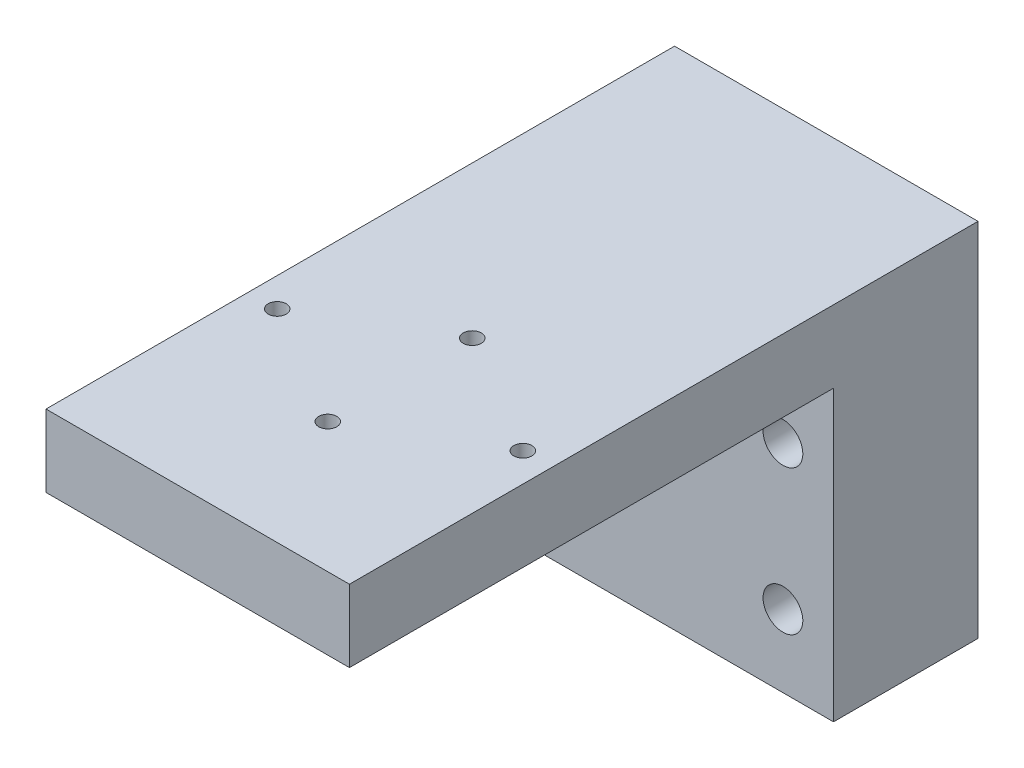
ISO-10303-21;
HEADER;
FILE_DESCRIPTION(('STEP AP214'),'2;1');
FILE_NAME('part.step','',(''),(''),'','','');
FILE_SCHEMA(('AUTOMOTIVE_DESIGN { 1 0 10303 214 1 1 1 1 }'));
ENDSEC;
DATA;
#1=APPLICATION_CONTEXT('core data for automotive mechanical design processes');
#2=APPLICATION_PROTOCOL_DEFINITION('international standard','automotive_design',2000,#1);
#3=PRODUCT_CONTEXT('',#1,'mechanical');
#4=PRODUCT('Part','Part','',(#3));
#5=PRODUCT_RELATED_PRODUCT_CATEGORY('part','',(#4));
#6=PRODUCT_DEFINITION_FORMATION('','',#4);
#7=PRODUCT_DEFINITION_CONTEXT('part definition',#1,'design');
#8=PRODUCT_DEFINITION('design','',#6,#7);
#9=PRODUCT_DEFINITION_SHAPE('','',#8);
#10=(LENGTH_UNIT() NAMED_UNIT(*) SI_UNIT(.MILLI.,.METRE.));
#11=(NAMED_UNIT(*) PLANE_ANGLE_UNIT() SI_UNIT($,.RADIAN.));
#12=(NAMED_UNIT(*) SI_UNIT($,.STERADIAN.) SOLID_ANGLE_UNIT());
#13=UNCERTAINTY_MEASURE_WITH_UNIT(LENGTH_MEASURE(1.E-05),#10,'distance_accuracy_value','');
#14=(GEOMETRIC_REPRESENTATION_CONTEXT(3) GLOBAL_UNCERTAINTY_ASSIGNED_CONTEXT((#13)) GLOBAL_UNIT_ASSIGNED_CONTEXT((#10,
#11,#12)) REPRESENTATION_CONTEXT('',''));
#15=CARTESIAN_POINT('',(0.,0.,0.));
#16=DIRECTION('',(0.,0.,1.));
#17=DIRECTION('',(1.,0.,0.));
#18=AXIS2_PLACEMENT_3D('',#15,#16,#17);
#19=CARTESIAN_POINT('',(0.,0.,87.));
#20=DIRECTION('',(1.,0.,0.));
#21=DIRECTION('',(0.,0.,-1.));
#22=AXIS2_PLACEMENT_3D('',#19,#20,#21);
#23=PLANE('',#22);
#24=DIRECTION('',(0.,1.,0.));
#25=VECTOR('',#24,1.);
#26=CARTESIAN_POINT('',(0.,0.,20.));
#27=LINE('',#26,#25);
#28=CARTESIAN_POINT('',(0.,0.,20.));
#29=VERTEX_POINT('',#28);
#30=CARTESIAN_POINT('',(0.,40.,20.));
#31=VERTEX_POINT('',#30);
#32=EDGE_CURVE('E125',#29,#31,#27,.T.);
#33=ORIENTED_EDGE('',*,*,#32,.T.);
#34=DIRECTION('',(0.,0.,1.));
#35=VECTOR('',#34,1.);
#36=CARTESIAN_POINT('',(0.,40.,87.));
#37=LINE('',#36,#35);
#38=CARTESIAN_POINT('',(0.,40.,87.));
#39=VERTEX_POINT('',#38);
#40=EDGE_CURVE('E206',#31,#39,#37,.T.);
#41=ORIENTED_EDGE('',*,*,#40,.T.);
#42=DIRECTION('',(0.,-1.,0.));
#43=VECTOR('',#42,1.);
#44=CARTESIAN_POINT('',(0.,0.,87.));
#45=LINE('',#44,#43);
#46=CARTESIAN_POINT('',(0.,50.,87.));
#47=VERTEX_POINT('',#46);
#48=EDGE_CURVE('E86',#47,#39,#45,.T.);
#49=ORIENTED_EDGE('',*,*,#48,.F.);
#50=DIRECTION('',(0.,0.,-1.));
#51=VECTOR('',#50,1.);
#52=CARTESIAN_POINT('',(0.,50.,87.));
#53=LINE('',#52,#51);
#54=CARTESIAN_POINT('',(0.,50.,0.));
#55=VERTEX_POINT('',#54);
#56=EDGE_CURVE('E79',#47,#55,#53,.T.);
#57=ORIENTED_EDGE('',*,*,#56,.T.);
#58=DIRECTION('',(0.,-1.,0.));
#59=VECTOR('',#58,1.);
#60=CARTESIAN_POINT('',(0.,0.,0.));
#61=LINE('',#60,#59);
#62=CARTESIAN_POINT('',(0.,0.,0.));
#63=VERTEX_POINT('',#62);
#64=EDGE_CURVE('E93',#55,#63,#61,.T.);
#65=ORIENTED_EDGE('',*,*,#64,.T.);
#66=DIRECTION('',(0.,0.,-1.));
#67=VECTOR('',#66,1.);
#68=CARTESIAN_POINT('',(0.,0.,87.));
#69=LINE('',#68,#67);
#70=EDGE_CURVE('E11',#29,#63,#69,.T.);
#71=ORIENTED_EDGE('',*,*,#70,.F.);
#72=EDGE_LOOP('',(#33,#41,#49,#57,#65,#71));
#73=FACE_BOUND('',#72,.T.);
#74=ADVANCED_FACE('F35',(#73),#23,.F.);
#75=CARTESIAN_POINT('',(0.,0.,87.));
#76=DIRECTION('',(0.,1.,0.));
#77=DIRECTION('',(0.,0.,1.));
#78=AXIS2_PLACEMENT_3D('',#75,#76,#77);
#79=PLANE('',#78);
#80=DIRECTION('',(0.,0.,-1.));
#81=VECTOR('',#80,1.);
#82=CARTESIAN_POINT('',(42.,0.,87.));
#83=LINE('',#82,#81);
#84=CARTESIAN_POINT('',(42.,0.,20.));
#85=VERTEX_POINT('',#84);
#86=CARTESIAN_POINT('',(42.,0.,0.));
#87=VERTEX_POINT('',#86);
#88=EDGE_CURVE('E42',#85,#87,#83,.T.);
#89=ORIENTED_EDGE('',*,*,#88,.F.);
#90=DIRECTION('',(1.,0.,0.));
#91=VECTOR('',#90,1.);
#92=CARTESIAN_POINT('',(0.,0.,20.));
#93=LINE('',#92,#91);
#94=EDGE_CURVE('E122',#29,#85,#93,.T.);
#95=ORIENTED_EDGE('',*,*,#94,.F.);
#96=ORIENTED_EDGE('',*,*,#70,.T.);
#97=DIRECTION('',(1.,0.,0.));
#98=VECTOR('',#97,1.);
#99=CARTESIAN_POINT('',(0.,0.,0.));
#100=LINE('',#99,#98);
#101=EDGE_CURVE('E99',#63,#87,#100,.T.);
#102=ORIENTED_EDGE('',*,*,#101,.T.);
#103=EDGE_LOOP('',(#89,#95,#96,#102));
#104=FACE_BOUND('',#103,.T.);
#105=ADVANCED_FACE('F119',(#104),#79,.F.);
#106=CARTESIAN_POINT('',(42.,0.,87.));
#107=DIRECTION('',(-1.,0.,0.));
#108=DIRECTION('',(0.,0.,1.));
#109=AXIS2_PLACEMENT_3D('',#106,#107,#108);
#110=PLANE('',#109);
#111=DIRECTION('',(0.,1.,0.));
#112=VECTOR('',#111,1.);
#113=CARTESIAN_POINT('',(42.,0.,87.));
#114=LINE('',#113,#112);
#115=CARTESIAN_POINT('',(42.,40.,87.));
#116=VERTEX_POINT('',#115);
#117=CARTESIAN_POINT('',(42.,50.,87.));
#118=VERTEX_POINT('',#117);
#119=EDGE_CURVE('E212',#116,#118,#114,.T.);
#120=ORIENTED_EDGE('',*,*,#119,.F.);
#121=DIRECTION('',(0.,0.,1.));
#122=VECTOR('',#121,1.);
#123=CARTESIAN_POINT('',(42.,40.,87.));
#124=LINE('',#123,#122);
#125=CARTESIAN_POINT('',(42.,40.,20.));
#126=VERTEX_POINT('',#125);
#127=EDGE_CURVE('E49',#126,#116,#124,.T.);
#128=ORIENTED_EDGE('',*,*,#127,.F.);
#129=DIRECTION('',(0.,1.,0.));
#130=VECTOR('',#129,1.);
#131=CARTESIAN_POINT('',(42.,0.,20.));
#132=LINE('',#131,#130);
#133=EDGE_CURVE('E116',#85,#126,#132,.T.);
#134=ORIENTED_EDGE('',*,*,#133,.F.);
#135=ORIENTED_EDGE('',*,*,#88,.T.);
#136=DIRECTION('',(0.,1.,0.));
#137=VECTOR('',#136,1.);
#138=CARTESIAN_POINT('',(42.,0.,0.));
#139=LINE('',#138,#137);
#140=CARTESIAN_POINT('',(42.,50.,0.));
#141=VERTEX_POINT('',#140);
#142=EDGE_CURVE('E87',#87,#141,#139,.T.);
#143=ORIENTED_EDGE('',*,*,#142,.T.);
#144=DIRECTION('',(0.,0.,-1.));
#145=VECTOR('',#144,1.);
#146=CARTESIAN_POINT('',(42.,50.,87.));
#147=LINE('',#146,#145);
#148=EDGE_CURVE('E82',#118,#141,#147,.T.);
#149=ORIENTED_EDGE('',*,*,#148,.F.);
#150=EDGE_LOOP('',(#120,#128,#134,#135,#143,#149));
#151=FACE_BOUND('',#150,.T.);
#152=ADVANCED_FACE('F113',(#151),#110,.F.);
#153=CARTESIAN_POINT('',(0.,50.,87.));
#154=DIRECTION('',(0.,-1.,0.));
#155=DIRECTION('',(0.,0.,-1.));
#156=AXIS2_PLACEMENT_3D('',#153,#154,#155);
#157=PLANE('',#156);
#158=CARTESIAN_POINT('',(3.99999999999992,50.,58.9999999999998));
#159=DIRECTION('',(0.,1.,0.));
#160=DIRECTION('',(0.,0.,1.));
#161=AXIS2_PLACEMENT_3D('',#158,#159,#160);
#162=CIRCLE('',#161,1.25);
#163=CARTESIAN_POINT('',(3.99999999999992,50.,60.2499999999998));
#164=VERTEX_POINT('',#163);
#165=EDGE_CURVE('E159',#164,#164,#162,.T.);
#166=ORIENTED_EDGE('',*,*,#165,.F.);
#167=EDGE_LOOP('',(#166));
#168=FACE_BOUND('',#167,.T.);
#169=CARTESIAN_POINT('',(20.9999999999999,50.,48.9999999999998));
#170=DIRECTION('',(0.,1.,0.));
#171=DIRECTION('',(0.,0.,1.));
#172=AXIS2_PLACEMENT_3D('',#169,#170,#171);
#173=CIRCLE('',#172,1.25);
#174=CARTESIAN_POINT('',(20.9999999999999,50.,50.2499999999998));
#175=VERTEX_POINT('',#174);
#176=EDGE_CURVE('E158',#175,#175,#173,.T.);
#177=ORIENTED_EDGE('',*,*,#176,.F.);
#178=EDGE_LOOP('',(#177));
#179=FACE_BOUND('',#178,.T.);
#180=CARTESIAN_POINT('',(37.9999999999999,50.,58.9999999999998));
#181=DIRECTION('',(0.,1.,0.));
#182=DIRECTION('',(0.,0.,1.));
#183=AXIS2_PLACEMENT_3D('',#180,#181,#182);
#184=CIRCLE('',#183,1.25);
#185=CARTESIAN_POINT('',(37.9999999999999,50.,60.2499999999998));
#186=VERTEX_POINT('',#185);
#187=EDGE_CURVE('E169',#186,#186,#184,.T.);
#188=ORIENTED_EDGE('',*,*,#187,.F.);
#189=EDGE_LOOP('',(#188));
#190=FACE_BOUND('',#189,.T.);
#191=CARTESIAN_POINT('',(20.9999999999999,50.,68.9999999999998));
#192=DIRECTION('',(0.,1.,0.));
#193=DIRECTION('',(0.,0.,1.));
#194=AXIS2_PLACEMENT_3D('',#191,#192,#193);
#195=CIRCLE('',#194,1.25);
#196=CARTESIAN_POINT('',(20.9999999999999,50.,70.2499999999998));
#197=VERTEX_POINT('',#196);
#198=EDGE_CURVE('E175',#197,#197,#195,.T.);
#199=ORIENTED_EDGE('',*,*,#198,.F.);
#200=EDGE_LOOP('',(#199));
#201=FACE_BOUND('',#200,.T.);
#202=DIRECTION('',(-1.,0.,0.));
#203=VECTOR('',#202,1.);
#204=CARTESIAN_POINT('',(0.,50.,0.));
#205=LINE('',#204,#203);
#206=EDGE_CURVE('E76',#141,#55,#205,.T.);
#207=ORIENTED_EDGE('',*,*,#206,.T.);
#208=ORIENTED_EDGE('',*,*,#56,.F.);
#209=DIRECTION('',(-1.,0.,0.));
#210=VECTOR('',#209,1.);
#211=CARTESIAN_POINT('',(0.,50.,87.));
#212=LINE('',#211,#210);
#213=EDGE_CURVE('E58',#118,#47,#212,.T.);
#214=ORIENTED_EDGE('',*,*,#213,.F.);
#215=ORIENTED_EDGE('',*,*,#148,.T.);
#216=EDGE_LOOP('',(#207,#208,#214,#215));
#217=FACE_BOUND('',#216,.T.);
#218=ADVANCED_FACE('F78',(#168,#179,#190,#201,#217),#157,.F.);
#219=CARTESIAN_POINT('',(0.,50.,87.));
#220=DIRECTION('',(0.,0.,-1.));
#221=DIRECTION('',(-1.,0.,0.));
#222=AXIS2_PLACEMENT_3D('',#219,#220,#221);
#223=PLANE('',#222);
#224=ORIENTED_EDGE('',*,*,#48,.T.);
#225=DIRECTION('',(1.,0.,0.));
#226=VECTOR('',#225,1.);
#227=CARTESIAN_POINT('',(0.,40.,87.));
#228=LINE('',#227,#226);
#229=EDGE_CURVE('E100',#39,#116,#228,.T.);
#230=ORIENTED_EDGE('',*,*,#229,.T.);
#231=ORIENTED_EDGE('',*,*,#119,.T.);
#232=ORIENTED_EDGE('',*,*,#213,.T.);
#233=EDGE_LOOP('',(#224,#230,#231,#232));
#234=FACE_BOUND('',#233,.T.);
#235=ADVANCED_FACE('F213',(#234),#223,.F.);
#236=CARTESIAN_POINT('',(0.,50.,0.));
#237=DIRECTION('',(0.,0.,-1.));
#238=DIRECTION('',(-1.,0.,0.));
#239=AXIS2_PLACEMENT_3D('',#236,#237,#238);
#240=PLANE('',#239);
#241=CARTESIAN_POINT('',(35.,30.,0.));
#242=DIRECTION('',(0.,0.,1.));
#243=DIRECTION('',(-1.,0.,0.));
#244=AXIS2_PLACEMENT_3D('',#241,#242,#243);
#245=CIRCLE('',#244,2.75);
#246=CARTESIAN_POINT('',(32.25,30.,0.));
#247=VERTEX_POINT('',#246);
#248=EDGE_CURVE('E182',#247,#247,#245,.T.);
#249=ORIENTED_EDGE('',*,*,#248,.T.);
#250=EDGE_LOOP('',(#249));
#251=FACE_BOUND('',#250,.T.);
#252=CARTESIAN_POINT('',(35.,10.,0.));
#253=DIRECTION('',(0.,0.,1.));
#254=DIRECTION('',(-1.,0.,0.));
#255=AXIS2_PLACEMENT_3D('',#252,#253,#254);
#256=CIRCLE('',#255,2.75);
#257=CARTESIAN_POINT('',(32.25,10.,0.));
#258=VERTEX_POINT('',#257);
#259=EDGE_CURVE('E188',#258,#258,#256,.T.);
#260=ORIENTED_EDGE('',*,*,#259,.T.);
#261=EDGE_LOOP('',(#260));
#262=FACE_BOUND('',#261,.T.);
#263=CARTESIAN_POINT('',(7.,10.,0.));
#264=DIRECTION('',(0.,0.,1.));
#265=DIRECTION('',(1.,0.,0.));
#266=AXIS2_PLACEMENT_3D('',#263,#264,#265);
#267=CIRCLE('',#266,2.75);
#268=CARTESIAN_POINT('',(9.75,10.,0.));
#269=VERTEX_POINT('',#268);
#270=EDGE_CURVE('E194',#269,#269,#267,.T.);
#271=ORIENTED_EDGE('',*,*,#270,.T.);
#272=EDGE_LOOP('',(#271));
#273=FACE_BOUND('',#272,.T.);
#274=CARTESIAN_POINT('',(7.,30.,0.));
#275=DIRECTION('',(0.,0.,1.));
#276=DIRECTION('',(1.,0.,0.));
#277=AXIS2_PLACEMENT_3D('',#274,#275,#276);
#278=CIRCLE('',#277,2.75);
#279=CARTESIAN_POINT('',(9.75,30.,0.));
#280=VERTEX_POINT('',#279);
#281=EDGE_CURVE('E200',#280,#280,#278,.T.);
#282=ORIENTED_EDGE('',*,*,#281,.T.);
#283=EDGE_LOOP('',(#282));
#284=FACE_BOUND('',#283,.T.);
#285=ORIENTED_EDGE('',*,*,#64,.F.);
#286=ORIENTED_EDGE('',*,*,#206,.F.);
#287=ORIENTED_EDGE('',*,*,#142,.F.);
#288=ORIENTED_EDGE('',*,*,#101,.F.);
#289=EDGE_LOOP('',(#285,#286,#287,#288));
#290=FACE_BOUND('',#289,.T.);
#291=ADVANCED_FACE('F97',(#251,#262,#273,#284,#290),#240,.T.);
#292=CARTESIAN_POINT('',(0.,40.,87.));
#293=DIRECTION('',(0.,1.,0.));
#294=DIRECTION('',(0.,0.,1.));
#295=AXIS2_PLACEMENT_3D('',#292,#293,#294);
#296=PLANE('',#295);
#297=ORIENTED_EDGE('',*,*,#127,.T.);
#298=ORIENTED_EDGE('',*,*,#229,.F.);
#299=ORIENTED_EDGE('',*,*,#40,.F.);
#300=DIRECTION('',(1.,0.,0.));
#301=VECTOR('',#300,1.);
#302=CARTESIAN_POINT('',(0.,40.,20.));
#303=LINE('',#302,#301);
#304=EDGE_CURVE('E103',#31,#126,#303,.T.);
#305=ORIENTED_EDGE('',*,*,#304,.T.);
#306=EDGE_LOOP('',(#297,#298,#299,#305));
#307=FACE_BOUND('',#306,.T.);
#308=ADVANCED_FACE('F215',(#307),#296,.F.);
#309=CARTESIAN_POINT('',(0.,0.,20.));
#310=DIRECTION('',(0.,0.,-1.));
#311=DIRECTION('',(-1.,0.,0.));
#312=AXIS2_PLACEMENT_3D('',#309,#310,#311);
#313=PLANE('',#312);
#314=CARTESIAN_POINT('',(35.,30.,20.));
#315=DIRECTION('',(0.,0.,1.));
#316=DIRECTION('',(-1.,0.,0.));
#317=AXIS2_PLACEMENT_3D('',#314,#315,#316);
#318=CIRCLE('',#317,2.75);
#319=CARTESIAN_POINT('',(32.25,30.,20.));
#320=VERTEX_POINT('',#319);
#321=EDGE_CURVE('E181',#320,#320,#318,.T.);
#322=ORIENTED_EDGE('',*,*,#321,.F.);
#323=EDGE_LOOP('',(#322));
#324=FACE_BOUND('',#323,.T.);
#325=CARTESIAN_POINT('',(35.,10.,20.));
#326=DIRECTION('',(0.,0.,1.));
#327=DIRECTION('',(-1.,0.,0.));
#328=AXIS2_PLACEMENT_3D('',#325,#326,#327);
#329=CIRCLE('',#328,2.75);
#330=CARTESIAN_POINT('',(32.25,10.,20.));
#331=VERTEX_POINT('',#330);
#332=EDGE_CURVE('E185',#331,#331,#329,.T.);
#333=ORIENTED_EDGE('',*,*,#332,.F.);
#334=EDGE_LOOP('',(#333));
#335=FACE_BOUND('',#334,.T.);
#336=CARTESIAN_POINT('',(7.,10.,20.));
#337=DIRECTION('',(0.,0.,1.));
#338=DIRECTION('',(1.,0.,0.));
#339=AXIS2_PLACEMENT_3D('',#336,#337,#338);
#340=CIRCLE('',#339,2.75);
#341=CARTESIAN_POINT('',(9.75,10.,20.));
#342=VERTEX_POINT('',#341);
#343=EDGE_CURVE('E191',#342,#342,#340,.T.);
#344=ORIENTED_EDGE('',*,*,#343,.F.);
#345=EDGE_LOOP('',(#344));
#346=FACE_BOUND('',#345,.T.);
#347=CARTESIAN_POINT('',(7.,30.,20.));
#348=DIRECTION('',(0.,0.,1.));
#349=DIRECTION('',(1.,0.,0.));
#350=AXIS2_PLACEMENT_3D('',#347,#348,#349);
#351=CIRCLE('',#350,2.75);
#352=CARTESIAN_POINT('',(9.75,30.,20.));
#353=VERTEX_POINT('',#352);
#354=EDGE_CURVE('E197',#353,#353,#351,.T.);
#355=ORIENTED_EDGE('',*,*,#354,.F.);
#356=EDGE_LOOP('',(#355));
#357=FACE_BOUND('',#356,.T.);
#358=ORIENTED_EDGE('',*,*,#133,.T.);
#359=ORIENTED_EDGE('',*,*,#304,.F.);
#360=ORIENTED_EDGE('',*,*,#32,.F.);
#361=ORIENTED_EDGE('',*,*,#94,.T.);
#362=EDGE_LOOP('',(#358,#359,#360,#361));
#363=FACE_BOUND('',#362,.T.);
#364=ADVANCED_FACE('F216',(#324,#335,#346,#357,#363),#313,.F.);
#365=CARTESIAN_POINT('',(7.,30.,0.));
#366=DIRECTION('',(0.,0.,1.));
#367=DIRECTION('',(1.,0.,0.));
#368=AXIS2_PLACEMENT_3D('',#365,#366,#367);
#369=CYLINDRICAL_SURFACE('',#368,2.75);
#370=ORIENTED_EDGE('',*,*,#281,.F.);
#371=EDGE_LOOP('',(#370));
#372=FACE_BOUND('',#371,.T.);
#373=ORIENTED_EDGE('',*,*,#354,.T.);
#374=EDGE_LOOP('',(#373));
#375=FACE_BOUND('',#374,.T.);
#376=ADVANCED_FACE('F218',(#372,#375),#369,.F.);
#377=CARTESIAN_POINT('',(7.,10.,0.));
#378=DIRECTION('',(0.,0.,1.));
#379=DIRECTION('',(1.,0.,0.));
#380=AXIS2_PLACEMENT_3D('',#377,#378,#379);
#381=CYLINDRICAL_SURFACE('',#380,2.75);
#382=ORIENTED_EDGE('',*,*,#270,.F.);
#383=EDGE_LOOP('',(#382));
#384=FACE_BOUND('',#383,.T.);
#385=ORIENTED_EDGE('',*,*,#343,.T.);
#386=EDGE_LOOP('',(#385));
#387=FACE_BOUND('',#386,.T.);
#388=ADVANCED_FACE('F226',(#384,#387),#381,.F.);
#389=CARTESIAN_POINT('',(35.,10.,0.));
#390=DIRECTION('',(0.,0.,1.));
#391=DIRECTION('',(1.,0.,0.));
#392=AXIS2_PLACEMENT_3D('',#389,#390,#391);
#393=CYLINDRICAL_SURFACE('',#392,2.75);
#394=ORIENTED_EDGE('',*,*,#259,.F.);
#395=EDGE_LOOP('',(#394));
#396=FACE_BOUND('',#395,.T.);
#397=ORIENTED_EDGE('',*,*,#332,.T.);
#398=EDGE_LOOP('',(#397));
#399=FACE_BOUND('',#398,.T.);
#400=ADVANCED_FACE('F277',(#396,#399),#393,.F.);
#401=CARTESIAN_POINT('',(35.,30.,0.));
#402=DIRECTION('',(0.,0.,1.));
#403=DIRECTION('',(1.,0.,0.));
#404=AXIS2_PLACEMENT_3D('',#401,#402,#403);
#405=CYLINDRICAL_SURFACE('',#404,2.75);
#406=ORIENTED_EDGE('',*,*,#248,.F.);
#407=EDGE_LOOP('',(#406));
#408=FACE_BOUND('',#407,.T.);
#409=ORIENTED_EDGE('',*,*,#321,.T.);
#410=EDGE_LOOP('',(#409));
#411=FACE_BOUND('',#410,.T.);
#412=ADVANCED_FACE('F285',(#408,#411),#405,.F.);
#413=CARTESIAN_POINT('',(20.9999999999999,42.5,68.9999999999998));
#414=DIRECTION('',(0.,1.,0.));
#415=DIRECTION('',(0.,0.,1.));
#416=AXIS2_PLACEMENT_3D('',#413,#414,#415);
#417=CONICAL_SURFACE('',#416,1.25,1.02974425867665);
#418=CARTESIAN_POINT('',(20.9999999999999,41.7489242262155,68.9999999999998));
#419=VERTEX_POINT('',#418);
#420=VERTEX_LOOP('',#419);
#421=FACE_BOUND('',#420,.T.);
#422=CARTESIAN_POINT('',(20.9999999999999,42.5,68.9999999999998));
#423=DIRECTION('',(0.,1.,0.));
#424=DIRECTION('',(0.,0.,1.));
#425=AXIS2_PLACEMENT_3D('',#422,#423,#424);
#426=CIRCLE('',#425,1.25);
#427=CARTESIAN_POINT('',(20.9999999999999,42.5,70.2499999999998));
#428=VERTEX_POINT('',#427);
#429=EDGE_CURVE('E178',#428,#428,#426,.T.);
#430=ORIENTED_EDGE('',*,*,#429,.T.);
#431=EDGE_LOOP('',(#430));
#432=FACE_BOUND('',#431,.T.);
#433=ADVANCED_FACE('F293',(#421,#432),#417,.F.);
#434=CARTESIAN_POINT('',(20.9999999999999,50.,68.9999999999998));
#435=DIRECTION('',(0.,1.,0.));
#436=DIRECTION('',(0.,0.,1.));
#437=AXIS2_PLACEMENT_3D('',#434,#435,#436);
#438=CYLINDRICAL_SURFACE('',#437,1.25);
#439=ORIENTED_EDGE('',*,*,#429,.F.);
#440=EDGE_LOOP('',(#439));
#441=FACE_BOUND('',#440,.T.);
#442=ORIENTED_EDGE('',*,*,#198,.T.);
#443=EDGE_LOOP('',(#442));
#444=FACE_BOUND('',#443,.T.);
#445=ADVANCED_FACE('F301',(#441,#444),#438,.F.);
#446=CARTESIAN_POINT('',(37.9999999999999,42.5,58.9999999999998));
#447=DIRECTION('',(0.,1.,0.));
#448=DIRECTION('',(0.,0.,1.));
#449=AXIS2_PLACEMENT_3D('',#446,#447,#448);
#450=CONICAL_SURFACE('',#449,1.25,1.02974425867666);
#451=CARTESIAN_POINT('',(37.9999999999999,41.7489242262155,58.9999999999998));
#452=VERTEX_POINT('',#451);
#453=VERTEX_LOOP('',#452);
#454=FACE_BOUND('',#453,.T.);
#455=CARTESIAN_POINT('',(37.9999999999999,42.5,58.9999999999998));
#456=DIRECTION('',(0.,1.,0.));
#457=DIRECTION('',(0.,0.,1.));
#458=AXIS2_PLACEMENT_3D('',#455,#456,#457);
#459=CIRCLE('',#458,1.25);
#460=CARTESIAN_POINT('',(37.9999999999999,42.5,60.2499999999998));
#461=VERTEX_POINT('',#460);
#462=EDGE_CURVE('E172',#461,#461,#459,.T.);
#463=ORIENTED_EDGE('',*,*,#462,.T.);
#464=EDGE_LOOP('',(#463));
#465=FACE_BOUND('',#464,.T.);
#466=ADVANCED_FACE('F309',(#454,#465),#450,.F.);
#467=CARTESIAN_POINT('',(37.9999999999999,50.,58.9999999999998));
#468=DIRECTION('',(0.,1.,0.));
#469=DIRECTION('',(0.,0.,1.));
#470=AXIS2_PLACEMENT_3D('',#467,#468,#469);
#471=CYLINDRICAL_SURFACE('',#470,1.25);
#472=ORIENTED_EDGE('',*,*,#462,.F.);
#473=EDGE_LOOP('',(#472));
#474=FACE_BOUND('',#473,.T.);
#475=ORIENTED_EDGE('',*,*,#187,.T.);
#476=EDGE_LOOP('',(#475));
#477=FACE_BOUND('',#476,.T.);
#478=ADVANCED_FACE('F317',(#474,#477),#471,.F.);
#479=CARTESIAN_POINT('',(20.9999999999999,42.5,48.9999999999998));
#480=DIRECTION('',(0.,1.,0.));
#481=DIRECTION('',(0.,0.,1.));
#482=AXIS2_PLACEMENT_3D('',#479,#480,#481);
#483=CONICAL_SURFACE('',#482,1.25,1.02974425867665);
#484=CARTESIAN_POINT('',(20.9999999999999,41.7489242262155,48.9999999999998));
#485=VERTEX_POINT('',#484);
#486=VERTEX_LOOP('',#485);
#487=FACE_BOUND('',#486,.T.);
#488=CARTESIAN_POINT('',(20.9999999999999,42.5,48.9999999999998));
#489=DIRECTION('',(0.,1.,0.));
#490=DIRECTION('',(0.,0.,1.));
#491=AXIS2_PLACEMENT_3D('',#488,#489,#490);
#492=CIRCLE('',#491,1.25);
#493=CARTESIAN_POINT('',(20.9999999999999,42.5,50.2499999999998));
#494=VERTEX_POINT('',#493);
#495=EDGE_CURVE('E162',#494,#494,#492,.T.);
#496=ORIENTED_EDGE('',*,*,#495,.T.);
#497=EDGE_LOOP('',(#496));
#498=FACE_BOUND('',#497,.T.);
#499=ADVANCED_FACE('F324',(#487,#498),#483,.F.);
#500=CARTESIAN_POINT('',(20.9999999999999,50.,48.9999999999998));
#501=DIRECTION('',(0.,1.,0.));
#502=DIRECTION('',(0.,0.,1.));
#503=AXIS2_PLACEMENT_3D('',#500,#501,#502);
#504=CYLINDRICAL_SURFACE('',#503,1.25);
#505=ORIENTED_EDGE('',*,*,#495,.F.);
#506=EDGE_LOOP('',(#505));
#507=FACE_BOUND('',#506,.T.);
#508=ORIENTED_EDGE('',*,*,#176,.T.);
#509=EDGE_LOOP('',(#508));
#510=FACE_BOUND('',#509,.T.);
#511=ADVANCED_FACE('F152',(#507,#510),#504,.F.);
#512=CARTESIAN_POINT('',(3.99999999999992,42.5,58.9999999999998));
#513=DIRECTION('',(0.,1.,0.));
#514=DIRECTION('',(0.,0.,1.));
#515=AXIS2_PLACEMENT_3D('',#512,#513,#514);
#516=CONICAL_SURFACE('',#515,1.25,1.02974425867665);
#517=CARTESIAN_POINT('',(3.99999999999992,41.7489242262155,58.9999999999998));
#518=VERTEX_POINT('',#517);
#519=VERTEX_LOOP('',#518);
#520=FACE_BOUND('',#519,.T.);
#521=CARTESIAN_POINT('',(3.99999999999992,42.5,58.9999999999998));
#522=DIRECTION('',(0.,1.,0.));
#523=DIRECTION('',(0.,0.,1.));
#524=AXIS2_PLACEMENT_3D('',#521,#522,#523);
#525=CIRCLE('',#524,1.25);
#526=CARTESIAN_POINT('',(3.99999999999992,42.5,60.2499999999998));
#527=VERTEX_POINT('',#526);
#528=EDGE_CURVE('E156',#527,#527,#525,.T.);
#529=ORIENTED_EDGE('',*,*,#528,.T.);
#530=EDGE_LOOP('',(#529));
#531=FACE_BOUND('',#530,.T.);
#532=ADVANCED_FACE('F148',(#520,#531),#516,.F.);
#533=CARTESIAN_POINT('',(3.99999999999992,50.,58.9999999999998));
#534=DIRECTION('',(0.,1.,0.));
#535=DIRECTION('',(0.,0.,1.));
#536=AXIS2_PLACEMENT_3D('',#533,#534,#535);
#537=CYLINDRICAL_SURFACE('',#536,1.25);
#538=ORIENTED_EDGE('',*,*,#528,.F.);
#539=EDGE_LOOP('',(#538));
#540=FACE_BOUND('',#539,.T.);
#541=ORIENTED_EDGE('',*,*,#165,.T.);
#542=EDGE_LOOP('',(#541));
#543=FACE_BOUND('',#542,.T.);
#544=ADVANCED_FACE('F151',(#540,#543),#537,.F.);
#545=CLOSED_SHELL('',(#74,#105,#152,#218,#235,#291,#308,#364,#376,#388,#400,#412,#433,#445,#466,
#478,#499,#511,#532,#544));
#546=MANIFOLD_SOLID_BREP('B2',#545);
#547=ADVANCED_BREP_SHAPE_REPRESENTATION('',(#18,#546),#14);
#548=SHAPE_DEFINITION_REPRESENTATION(#9,#547);
ENDSEC;
END-ISO-10303-21;
